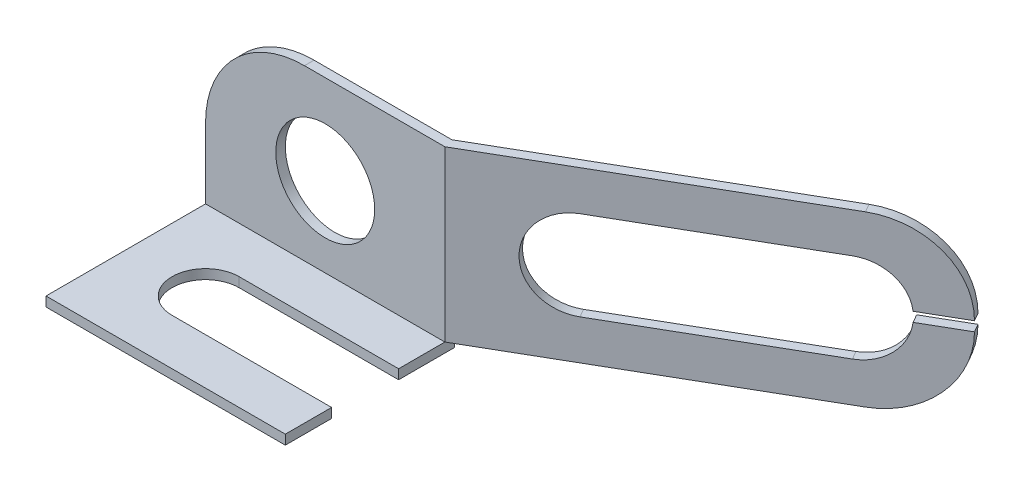
ISO-10303-21;
HEADER;
FILE_DESCRIPTION(('STEP AP214'),'2;1');
FILE_NAME('part.step','',(''),(''),'','','');
FILE_SCHEMA(('AUTOMOTIVE_DESIGN { 1 0 10303 214 1 1 1 1 }'));
ENDSEC;
DATA;
#1=APPLICATION_CONTEXT('core data for automotive mechanical design processes');
#2=APPLICATION_PROTOCOL_DEFINITION('international standard','automotive_design',2000,#1);
#3=PRODUCT_CONTEXT('',#1,'mechanical');
#4=PRODUCT('Part','Part','',(#3));
#5=PRODUCT_RELATED_PRODUCT_CATEGORY('part','',(#4));
#6=PRODUCT_DEFINITION_FORMATION('','',#4);
#7=PRODUCT_DEFINITION_CONTEXT('part definition',#1,'design');
#8=PRODUCT_DEFINITION('design','',#6,#7);
#9=PRODUCT_DEFINITION_SHAPE('','',#8);
#10=(LENGTH_UNIT() NAMED_UNIT(*) SI_UNIT(.MILLI.,.METRE.));
#11=(NAMED_UNIT(*) PLANE_ANGLE_UNIT() SI_UNIT($,.RADIAN.));
#12=(NAMED_UNIT(*) SI_UNIT($,.STERADIAN.) SOLID_ANGLE_UNIT());
#13=UNCERTAINTY_MEASURE_WITH_UNIT(LENGTH_MEASURE(1.E-05),#10,'distance_accuracy_value','');
#14=(GEOMETRIC_REPRESENTATION_CONTEXT(3) GLOBAL_UNCERTAINTY_ASSIGNED_CONTEXT((#13)) GLOBAL_UNIT_ASSIGNED_CONTEXT((#10,
#11,#12)) REPRESENTATION_CONTEXT('',''));
#15=CARTESIAN_POINT('',(0.,0.,0.));
#16=DIRECTION('',(0.,0.,1.));
#17=DIRECTION('',(1.,0.,0.));
#18=AXIS2_PLACEMENT_3D('',#15,#16,#17);
#19=CARTESIAN_POINT('',(750.,-530.,1000.));
#20=DIRECTION('',(1.,0.,0.));
#21=DIRECTION('',(0.,1.,0.));
#22=AXIS2_PLACEMENT_3D('',#19,#20,#21);
#23=PLANE('',#22);
#24=DIRECTION('',(0.,0.,-1.));
#25=VECTOR('',#24,1.);
#26=CARTESIAN_POINT('',(750.,-530.,1000.));
#27=LINE('',#26,#25);
#28=CARTESIAN_POINT('',(750.000000000014,-530.00000000002,-8.3221374941428E-12));
#29=VERTEX_POINT('',#28);
#30=CARTESIAN_POINT('',(750.,-530.,-60.));
#31=VERTEX_POINT('',#30);
#32=EDGE_CURVE('E279',#29,#31,#27,.T.);
#33=ORIENTED_EDGE('',*,*,#32,.F.);
#34=DIRECTION('',(0.,0.,-1.));
#35=VECTOR('',#34,1.);
#36=CARTESIAN_POINT('',(750.,-530.,1000.));
#37=LINE('',#36,#35);
#38=CARTESIAN_POINT('',(750.,-530.,290.));
#39=VERTEX_POINT('',#38);
#40=EDGE_CURVE('E359',#39,#29,#37,.T.);
#41=ORIENTED_EDGE('',*,*,#40,.F.);
#42=DIRECTION('',(0.,1.,0.));
#43=VECTOR('',#42,1.);
#44=CARTESIAN_POINT('',(750.,-590.,290.));
#45=LINE('',#44,#43);
#46=CARTESIAN_POINT('',(750.,-590.,290.));
#47=VERTEX_POINT('',#46);
#48=EDGE_CURVE('E303',#47,#39,#45,.T.);
#49=ORIENTED_EDGE('',*,*,#48,.F.);
#50=DIRECTION('',(0.,0.,-1.));
#51=VECTOR('',#50,1.);
#52=CARTESIAN_POINT('',(750.000000000001,-590.,1000.));
#53=LINE('',#52,#51);
#54=CARTESIAN_POINT('',(750.,-590.,-60.));
#55=VERTEX_POINT('',#54);
#56=EDGE_CURVE('E45',#47,#55,#53,.T.);
#57=ORIENTED_EDGE('',*,*,#56,.T.);
#58=DIRECTION('',(0.,1.,0.));
#59=VECTOR('',#58,1.);
#60=CARTESIAN_POINT('',(750.,-590.,-60.));
#61=LINE('',#60,#59);
#62=EDGE_CURVE('E341',#55,#31,#61,.T.);
#63=ORIENTED_EDGE('',*,*,#62,.T.);
#64=EDGE_LOOP('',(#33,#41,#49,#57,#63));
#65=FACE_BOUND('',#64,.T.);
#66=ADVANCED_FACE('F37',(#65),#23,.T.);
#67=CARTESIAN_POINT('',(-750.000000000001,-590.,1000.));
#68=DIRECTION('',(0.,1.,0.));
#69=DIRECTION('',(0.,0.,1.));
#70=AXIS2_PLACEMENT_3D('',#67,#68,#69);
#71=PLANE('',#70);
#72=ORIENTED_EDGE('',*,*,#56,.F.);
#73=DIRECTION('',(-1.,0.,0.));
#74=VECTOR('',#73,1.);
#75=CARTESIAN_POINT('',(-250.,-590.,290.));
#76=LINE('',#75,#74);
#77=CARTESIAN_POINT('',(-250.,-590.,290.));
#78=VERTEX_POINT('',#77);
#79=EDGE_CURVE('E291',#47,#78,#76,.T.);
#80=ORIENTED_EDGE('',*,*,#79,.T.);
#81=CARTESIAN_POINT('',(-250.,-590.,500.));
#82=DIRECTION('',(0.,1.,0.));
#83=DIRECTION('',(0.,0.,1.));
#84=AXIS2_PLACEMENT_3D('',#81,#82,#83);
#85=CIRCLE('',#84,210.);
#86=CARTESIAN_POINT('',(-250.,-590.,710.));
#87=VERTEX_POINT('',#86);
#88=EDGE_CURVE('E284',#78,#87,#85,.T.);
#89=ORIENTED_EDGE('',*,*,#88,.T.);
#90=DIRECTION('',(1.,0.,0.));
#91=VECTOR('',#90,1.);
#92=CARTESIAN_POINT('',(-250.,-590.,710.));
#93=LINE('',#92,#91);
#94=CARTESIAN_POINT('',(750.,-590.,710.));
#95=VERTEX_POINT('',#94);
#96=EDGE_CURVE('E287',#87,#95,#93,.T.);
#97=ORIENTED_EDGE('',*,*,#96,.T.);
#98=CARTESIAN_POINT('',(750.000000000001,-590.,1000.));
#99=VERTEX_POINT('',#98);
#100=EDGE_CURVE('E11',#99,#95,#53,.T.);
#101=ORIENTED_EDGE('',*,*,#100,.F.);
#102=DIRECTION('',(1.,0.,0.));
#103=VECTOR('',#102,1.);
#104=CARTESIAN_POINT('',(-750.000000000001,-590.,1000.));
#105=LINE('',#104,#103);
#106=CARTESIAN_POINT('',(-750.000000000001,-590.,1000.));
#107=VERTEX_POINT('',#106);
#108=EDGE_CURVE('E345',#107,#99,#105,.T.);
#109=ORIENTED_EDGE('',*,*,#108,.F.);
#110=DIRECTION('',(0.,0.,-1.));
#111=VECTOR('',#110,1.);
#112=CARTESIAN_POINT('',(-750.000000000001,-590.,1000.));
#113=LINE('',#112,#111);
#114=CARTESIAN_POINT('',(-750.,-590.,-60.));
#115=VERTEX_POINT('',#114);
#116=EDGE_CURVE('E355',#107,#115,#113,.T.);
#117=ORIENTED_EDGE('',*,*,#116,.T.);
#118=DIRECTION('',(1.,0.,0.));
#119=VECTOR('',#118,1.);
#120=CARTESIAN_POINT('',(-750.,-590.,-60.));
#121=LINE('',#120,#119);
#122=EDGE_CURVE('E337',#115,#55,#121,.T.);
#123=ORIENTED_EDGE('',*,*,#122,.T.);
#124=EDGE_LOOP('',(#72,#80,#89,#97,#101,#109,#117,#123));
#125=FACE_BOUND('',#124,.T.);
#126=ADVANCED_FACE('F39',(#125),#71,.F.);
#127=DIRECTION('',(0.,1.,0.));
#128=VECTOR('',#127,1.);
#129=CARTESIAN_POINT('',(750.,-590.,710.));
#130=LINE('',#129,#128);
#131=CARTESIAN_POINT('',(750.,-530.,710.));
#132=VERTEX_POINT('',#131);
#133=EDGE_CURVE('E305',#95,#132,#130,.T.);
#134=ORIENTED_EDGE('',*,*,#133,.T.);
#135=CARTESIAN_POINT('',(750.,-530.,1000.));
#136=VERTEX_POINT('',#135);
#137=EDGE_CURVE('E360',#136,#132,#37,.T.);
#138=ORIENTED_EDGE('',*,*,#137,.F.);
#139=DIRECTION('',(0.,-1.,0.));
#140=VECTOR('',#139,1.);
#141=CARTESIAN_POINT('',(750.,-530.,1000.));
#142=LINE('',#141,#140);
#143=EDGE_CURVE('E347',#136,#99,#142,.T.);
#144=ORIENTED_EDGE('',*,*,#143,.T.);
#145=ORIENTED_EDGE('',*,*,#100,.T.);
#146=EDGE_LOOP('',(#134,#138,#144,#145));
#147=FACE_BOUND('',#146,.T.);
#148=ADVANCED_FACE('F407',(#147),#23,.T.);
#149=CARTESIAN_POINT('',(-750.,-530.,1000.));
#150=DIRECTION('',(0.,1.,0.));
#151=DIRECTION('',(0.,0.,1.));
#152=AXIS2_PLACEMENT_3D('',#149,#150,#151);
#153=PLANE('',#152);
#154=DIRECTION('',(-1.,0.,0.));
#155=VECTOR('',#154,1.);
#156=CARTESIAN_POINT('',(-250.,-530.,290.));
#157=LINE('',#156,#155);
#158=CARTESIAN_POINT('',(-250.,-530.,290.));
#159=VERTEX_POINT('',#158);
#160=EDGE_CURVE('E288',#39,#159,#157,.T.);
#161=ORIENTED_EDGE('',*,*,#160,.F.);
#162=ORIENTED_EDGE('',*,*,#40,.T.);
#163=DIRECTION('',(1.,0.,0.));
#164=VECTOR('',#163,1.);
#165=CARTESIAN_POINT('',(0.,-530.,0.));
#166=LINE('',#165,#164);
#167=CARTESIAN_POINT('',(-750.,-530.,0.));
#168=VERTEX_POINT('',#167);
#169=EDGE_CURVE('E331',#168,#29,#166,.T.);
#170=ORIENTED_EDGE('',*,*,#169,.F.);
#171=DIRECTION('',(0.,0.,-1.));
#172=VECTOR('',#171,1.);
#173=CARTESIAN_POINT('',(-750.,-530.,1000.));
#174=LINE('',#173,#172);
#175=CARTESIAN_POINT('',(-750.,-530.,1000.));
#176=VERTEX_POINT('',#175);
#177=EDGE_CURVE('E357',#176,#168,#174,.T.);
#178=ORIENTED_EDGE('',*,*,#177,.F.);
#179=DIRECTION('',(1.,0.,0.));
#180=VECTOR('',#179,1.);
#181=CARTESIAN_POINT('',(-750.,-530.,1000.));
#182=LINE('',#181,#180);
#183=EDGE_CURVE('E350',#176,#136,#182,.T.);
#184=ORIENTED_EDGE('',*,*,#183,.T.);
#185=ORIENTED_EDGE('',*,*,#137,.T.);
#186=DIRECTION('',(1.,0.,0.));
#187=VECTOR('',#186,1.);
#188=CARTESIAN_POINT('',(-250.,-530.,710.));
#189=LINE('',#188,#187);
#190=CARTESIAN_POINT('',(-250.,-530.,710.));
#191=VERTEX_POINT('',#190);
#192=EDGE_CURVE('E296',#191,#132,#189,.T.);
#193=ORIENTED_EDGE('',*,*,#192,.F.);
#194=CARTESIAN_POINT('',(-250.,-530.,500.));
#195=DIRECTION('',(0.,1.,0.));
#196=DIRECTION('',(0.,0.,1.));
#197=AXIS2_PLACEMENT_3D('',#194,#195,#196);
#198=CIRCLE('',#197,210.);
#199=EDGE_CURVE('E283',#159,#191,#198,.T.);
#200=ORIENTED_EDGE('',*,*,#199,.F.);
#201=EDGE_LOOP('',(#161,#162,#170,#178,#184,#185,#193,#200));
#202=FACE_BOUND('',#201,.T.);
#203=ADVANCED_FACE('F368',(#202),#153,.T.);
#204=CARTESIAN_POINT('',(-750.,-530.,1000.));
#205=DIRECTION('',(1.,0.,0.));
#206=DIRECTION('',(0.,1.,0.));
#207=AXIS2_PLACEMENT_3D('',#204,#205,#206);
#208=PLANE('',#207);
#209=ORIENTED_EDGE('',*,*,#177,.T.);
#210=DIRECTION('',(0.,-1.,0.));
#211=VECTOR('',#210,1.);
#212=CARTESIAN_POINT('',(-750.000000000001,-1.89242561015654E-13,0.));
#213=LINE('',#212,#211);
#214=CARTESIAN_POINT('',(-750.000000000001,-90.0000000000041,0.));
#215=VERTEX_POINT('',#214);
#216=EDGE_CURVE('E328',#215,#168,#213,.T.);
#217=ORIENTED_EDGE('',*,*,#216,.F.);
#218=DIRECTION('',(0.,0.,1.));
#219=VECTOR('',#218,1.);
#220=CARTESIAN_POINT('',(-750.000000000001,-90.0000000000041,-60.));
#221=LINE('',#220,#219);
#222=CARTESIAN_POINT('',(-750.000000000001,-90.0000000000041,-60.));
#223=VERTEX_POINT('',#222);
#224=EDGE_CURVE('E335',#223,#215,#221,.T.);
#225=ORIENTED_EDGE('',*,*,#224,.F.);
#226=DIRECTION('',(0.,1.,0.));
#227=VECTOR('',#226,1.);
#228=CARTESIAN_POINT('',(-750.,-590.,-60.));
#229=LINE('',#228,#227);
#230=EDGE_CURVE('E343',#115,#223,#229,.T.);
#231=ORIENTED_EDGE('',*,*,#230,.F.);
#232=ORIENTED_EDGE('',*,*,#116,.F.);
#233=DIRECTION('',(0.,-1.,0.));
#234=VECTOR('',#233,1.);
#235=CARTESIAN_POINT('',(-750.,-530.,1000.));
#236=LINE('',#235,#234);
#237=EDGE_CURVE('E353',#176,#107,#236,.T.);
#238=ORIENTED_EDGE('',*,*,#237,.F.);
#239=EDGE_LOOP('',(#209,#217,#225,#231,#232,#238));
#240=FACE_BOUND('',#239,.T.);
#241=ADVANCED_FACE('F396',(#240),#208,.F.);
#242=CARTESIAN_POINT('',(0.,0.,1000.));
#243=DIRECTION('',(0.,0.,-1.));
#244=DIRECTION('',(-1.,0.,0.));
#245=AXIS2_PLACEMENT_3D('',#242,#243,#244);
#246=PLANE('',#245);
#247=ORIENTED_EDGE('',*,*,#108,.T.);
#248=ORIENTED_EDGE('',*,*,#143,.F.);
#249=ORIENTED_EDGE('',*,*,#183,.F.);
#250=ORIENTED_EDGE('',*,*,#237,.T.);
#251=EDGE_LOOP('',(#247,#248,#249,#250));
#252=FACE_BOUND('',#251,.T.);
#253=ADVANCED_FACE('F403',(#252),#246,.F.);
#254=CARTESIAN_POINT('',(-750.,-590.,-60.));
#255=DIRECTION('',(0.,0.,1.));
#256=DIRECTION('',(1.,0.,0.));
#257=AXIS2_PLACEMENT_3D('',#254,#255,#256);
#258=PLANE('',#257);
#259=DIRECTION('',(0.,-1.,0.));
#260=VECTOR('',#259,1.);
#261=CARTESIAN_POINT('',(733.923048454133,-589.999999999972,-60.));
#262=LINE('',#261,#260);
#263=CARTESIAN_POINT('',(733.923048454113,530.,-60.));
#264=VERTEX_POINT('',#263);
#265=CARTESIAN_POINT('',(733.923048454132,-530.00000000002,-60.));
#266=VERTEX_POINT('',#265);
#267=EDGE_CURVE('E52',#264,#266,#262,.T.);
#268=ORIENTED_EDGE('',*,*,#267,.T.);
#269=DIRECTION('',(1.,0.,0.));
#270=VECTOR('',#269,1.);
#271=CARTESIAN_POINT('',(-750.000000000002,-530.000000000027,-60.));
#272=LINE('',#271,#270);
#273=EDGE_CURVE('E56',#266,#31,#272,.T.);
#274=ORIENTED_EDGE('',*,*,#273,.T.);
#275=ORIENTED_EDGE('',*,*,#62,.F.);
#276=ORIENTED_EDGE('',*,*,#122,.F.);
#277=ORIENTED_EDGE('',*,*,#230,.T.);
#278=CARTESIAN_POINT('',(-130.000000000001,-89.9999999999995,-60.));
#279=DIRECTION('',(0.,0.,1.));
#280=DIRECTION('',(1.,0.,0.));
#281=AXIS2_PLACEMENT_3D('',#278,#279,#280);
#282=CIRCLE('',#281,620.);
#283=CARTESIAN_POINT('',(-129.999999999996,530.,-60.));
#284=VERTEX_POINT('',#283);
#285=EDGE_CURVE('E316',#284,#223,#282,.T.);
#286=ORIENTED_EDGE('',*,*,#285,.F.);
#287=DIRECTION('',(1.,0.,0.));
#288=VECTOR('',#287,1.);
#289=CARTESIAN_POINT('',(0.,530.,-60.));
#290=LINE('',#289,#288);
#291=EDGE_CURVE('E313',#284,#264,#290,.T.);
#292=ORIENTED_EDGE('',*,*,#291,.T.);
#293=EDGE_LOOP('',(#268,#274,#275,#276,#277,#286,#292));
#294=FACE_BOUND('',#293,.T.);
#295=CARTESIAN_POINT('',(0.,-29.9999999999997,-60.));
#296=DIRECTION('',(0.,0.,1.));
#297=DIRECTION('',(1.,0.,0.));
#298=AXIS2_PLACEMENT_3D('',#295,#296,#297);
#299=CIRCLE('',#298,310.);
#300=CARTESIAN_POINT('',(310.,-29.9999999999997,-60.));
#301=VERTEX_POINT('',#300);
#302=EDGE_CURVE('E310',#301,#301,#299,.T.);
#303=ORIENTED_EDGE('',*,*,#302,.T.);
#304=EDGE_LOOP('',(#303));
#305=FACE_BOUND('',#304,.T.);
#306=ADVANCED_FACE('F419',(#294,#305),#258,.F.);
#307=CARTESIAN_POINT('',(0.,530.,-60.));
#308=DIRECTION('',(0.,-1.,0.));
#309=DIRECTION('',(0.,0.,-1.));
#310=AXIS2_PLACEMENT_3D('',#307,#308,#309);
#311=PLANE('',#310);
#312=DIRECTION('',(1.,0.,0.));
#313=VECTOR('',#312,1.);
#314=CARTESIAN_POINT('',(0.,530.,0.));
#315=LINE('',#314,#313);
#316=CARTESIAN_POINT('',(-129.999999999996,530.,0.));
#317=VERTEX_POINT('',#316);
#318=CARTESIAN_POINT('',(749.999999999999,530.,0.));
#319=VERTEX_POINT('',#318);
#320=EDGE_CURVE('E322',#317,#319,#315,.T.);
#321=ORIENTED_EDGE('',*,*,#320,.T.);
#322=DIRECTION('',(0.866025403784435,0.,-0.500000000000007));
#323=VECTOR('',#322,1.);
#324=CARTESIAN_POINT('',(187.499999999993,529.99999999999,324.759526419163));
#325=LINE('',#324,#323);
#326=CARTESIAN_POINT('',(2421.42902930395,530.000000000031,-965.00000000002));
#327=VERTEX_POINT('',#326);
#328=EDGE_CURVE('E242',#319,#327,#325,.T.);
#329=ORIENTED_EDGE('',*,*,#328,.T.);
#330=DIRECTION('',(0.500000000000007,0.,0.866025403784434));
#331=VECTOR('',#330,1.);
#332=CARTESIAN_POINT('',(2391.42902930395,530.000000000031,-1016.96152422709));
#333=LINE('',#332,#331);
#334=CARTESIAN_POINT('',(2391.42902930395,530.000000000031,-1016.96152422709));
#335=VERTEX_POINT('',#334);
#336=EDGE_CURVE('E272',#335,#327,#333,.T.);
#337=ORIENTED_EDGE('',*,*,#336,.F.);
#338=DIRECTION('',(0.866025403784435,0.,-0.500000000000007));
#339=VECTOR('',#338,1.);
#340=CARTESIAN_POINT('',(157.499999999993,529.999999999989,272.798002192097));
#341=LINE('',#340,#339);
#342=EDGE_CURVE('E216',#264,#335,#341,.T.);
#343=ORIENTED_EDGE('',*,*,#342,.F.);
#344=ORIENTED_EDGE('',*,*,#291,.F.);
#345=DIRECTION('',(0.,0.,1.));
#346=VECTOR('',#345,1.);
#347=CARTESIAN_POINT('',(-129.999999999996,530.,-60.));
#348=LINE('',#347,#346);
#349=EDGE_CURVE('E319',#284,#317,#348,.T.);
#350=ORIENTED_EDGE('',*,*,#349,.T.);
#351=EDGE_LOOP('',(#321,#329,#337,#343,#344,#350));
#352=FACE_BOUND('',#351,.T.);
#353=ADVANCED_FACE('F386',(#352),#311,.F.);
#354=CARTESIAN_POINT('',(0.,-29.9999999999997,-60.));
#355=DIRECTION('',(0.,0.,1.));
#356=DIRECTION('',(1.,0.,0.));
#357=AXIS2_PLACEMENT_3D('',#354,#355,#356);
#358=CYLINDRICAL_SURFACE('',#357,310.);
#359=ORIENTED_EDGE('',*,*,#302,.F.);
#360=EDGE_LOOP('',(#359));
#361=FACE_BOUND('',#360,.T.);
#362=CARTESIAN_POINT('',(0.,-29.9999999999997,0.));
#363=DIRECTION('',(0.,0.,1.));
#364=DIRECTION('',(1.,0.,0.));
#365=AXIS2_PLACEMENT_3D('',#362,#363,#364);
#366=CIRCLE('',#365,310.);
#367=CARTESIAN_POINT('',(310.,-29.9999999999997,0.));
#368=VERTEX_POINT('',#367);
#369=EDGE_CURVE('E302',#368,#368,#366,.T.);
#370=ORIENTED_EDGE('',*,*,#369,.T.);
#371=EDGE_LOOP('',(#370));
#372=FACE_BOUND('',#371,.T.);
#373=ADVANCED_FACE('F425',(#361,#372),#358,.F.);
#374=CARTESIAN_POINT('',(-130.000000000001,-89.9999999999995,-60.));
#375=DIRECTION('',(0.,0.,1.));
#376=DIRECTION('',(1.,0.,0.));
#377=AXIS2_PLACEMENT_3D('',#374,#375,#376);
#378=CYLINDRICAL_SURFACE('',#377,620.);
#379=CARTESIAN_POINT('',(-130.000000000001,-89.9999999999995,0.));
#380=DIRECTION('',(0.,0.,1.));
#381=DIRECTION('',(1.,0.,0.));
#382=AXIS2_PLACEMENT_3D('',#379,#380,#381);
#383=CIRCLE('',#382,620.);
#384=EDGE_CURVE('E325',#317,#215,#383,.T.);
#385=ORIENTED_EDGE('',*,*,#384,.F.);
#386=ORIENTED_EDGE('',*,*,#349,.F.);
#387=ORIENTED_EDGE('',*,*,#285,.T.);
#388=ORIENTED_EDGE('',*,*,#224,.T.);
#389=EDGE_LOOP('',(#385,#386,#387,#388));
#390=FACE_BOUND('',#389,.T.);
#391=ADVANCED_FACE('F392',(#390),#378,.T.);
#392=CARTESIAN_POINT('',(0.,0.,0.));
#393=DIRECTION('',(0.,0.,1.));
#394=DIRECTION('',(1.,0.,0.));
#395=AXIS2_PLACEMENT_3D('',#392,#393,#394);
#396=PLANE('',#395);
#397=ORIENTED_EDGE('',*,*,#369,.F.);
#398=EDGE_LOOP('',(#397));
#399=FACE_BOUND('',#398,.T.);
#400=ORIENTED_EDGE('',*,*,#320,.F.);
#401=ORIENTED_EDGE('',*,*,#384,.T.);
#402=ORIENTED_EDGE('',*,*,#216,.T.);
#403=ORIENTED_EDGE('',*,*,#169,.T.);
#404=DIRECTION('',(0.,-1.,0.));
#405=VECTOR('',#404,1.);
#406=CARTESIAN_POINT('',(749.999999999999,1.57107031786579E-13,0.));
#407=LINE('',#406,#405);
#408=EDGE_CURVE('E314',#319,#29,#407,.T.);
#409=ORIENTED_EDGE('',*,*,#408,.F.);
#410=EDGE_LOOP('',(#400,#401,#402,#403,#409));
#411=FACE_BOUND('',#410,.T.);
#412=ADVANCED_FACE('F383',(#399,#411),#396,.T.);
#413=CARTESIAN_POINT('',(-250.,-590.,500.));
#414=DIRECTION('',(0.,1.,0.));
#415=DIRECTION('',(0.,0.,1.));
#416=AXIS2_PLACEMENT_3D('',#413,#414,#415);
#417=CYLINDRICAL_SURFACE('',#416,210.);
#418=ORIENTED_EDGE('',*,*,#199,.T.);
#419=DIRECTION('',(0.,1.,0.));
#420=VECTOR('',#419,1.);
#421=CARTESIAN_POINT('',(-250.,-590.,710.));
#422=LINE('',#421,#420);
#423=EDGE_CURVE('E294',#87,#191,#422,.T.);
#424=ORIENTED_EDGE('',*,*,#423,.F.);
#425=ORIENTED_EDGE('',*,*,#88,.F.);
#426=DIRECTION('',(0.,1.,0.));
#427=VECTOR('',#426,1.);
#428=CARTESIAN_POINT('',(-250.,-590.,290.));
#429=LINE('',#428,#427);
#430=EDGE_CURVE('E300',#78,#159,#429,.T.);
#431=ORIENTED_EDGE('',*,*,#430,.T.);
#432=EDGE_LOOP('',(#418,#424,#425,#431));
#433=FACE_BOUND('',#432,.T.);
#434=ADVANCED_FACE('F415',(#433),#417,.F.);
#435=CARTESIAN_POINT('',(-250.,-590.,290.));
#436=DIRECTION('',(0.,0.,-1.));
#437=DIRECTION('',(-1.,0.,0.));
#438=AXIS2_PLACEMENT_3D('',#435,#436,#437);
#439=PLANE('',#438);
#440=ORIENTED_EDGE('',*,*,#160,.T.);
#441=ORIENTED_EDGE('',*,*,#430,.F.);
#442=ORIENTED_EDGE('',*,*,#79,.F.);
#443=ORIENTED_EDGE('',*,*,#48,.T.);
#444=EDGE_LOOP('',(#440,#441,#442,#443));
#445=FACE_BOUND('',#444,.T.);
#446=ADVANCED_FACE('F417',(#445),#439,.F.);
#447=CARTESIAN_POINT('',(-250.,-590.,710.));
#448=DIRECTION('',(0.,0.,1.));
#449=DIRECTION('',(1.,0.,0.));
#450=AXIS2_PLACEMENT_3D('',#447,#448,#449);
#451=PLANE('',#450);
#452=ORIENTED_EDGE('',*,*,#192,.T.);
#453=ORIENTED_EDGE('',*,*,#133,.F.);
#454=ORIENTED_EDGE('',*,*,#96,.F.);
#455=ORIENTED_EDGE('',*,*,#423,.T.);
#456=EDGE_LOOP('',(#452,#453,#454,#455));
#457=FACE_BOUND('',#456,.T.);
#458=ADVANCED_FACE('F410',(#457),#451,.F.);
#459=CARTESIAN_POINT('',(157.500000000002,2.87964097012149E-12,272.798002192097));
#460=DIRECTION('',(-0.500000000000007,0.,-0.866025403784435));
#461=DIRECTION('',(-0.866025403784435,0.,0.500000000000007));
#462=AXIS2_PLACEMENT_3D('',#459,#460,#461);
#463=PLANE('',#462);
#464=ORIENTED_EDGE('',*,*,#267,.F.);
#465=ORIENTED_EDGE('',*,*,#342,.T.);
#466=CARTESIAN_POINT('',(2391.42902930396,30.0000000000308,-1016.96152422709));
#467=DIRECTION('',(-0.500000000000007,0.,-0.866025403784435));
#468=DIRECTION('',(-0.866025403784435,0.,0.500000000000007));
#469=AXIS2_PLACEMENT_3D('',#466,#467,#468);
#470=CIRCLE('',#469,500.);
#471=CARTESIAN_POINT('',(2824.44173119618,30.0000000000517,-1266.96152422709));
#472=VERTEX_POINT('',#471);
#473=EDGE_CURVE('E218',#335,#472,#470,.T.);
#474=ORIENTED_EDGE('',*,*,#473,.T.);
#475=DIRECTION('',(-0.866025403784435,0.,0.500000000000007));
#476=VECTOR('',#475,1.);
#477=CARTESIAN_POINT('',(157.500000000002,30.0000000000259,272.798002192097));
#478=LINE('',#477,#476);
#479=CARTESIAN_POINT('',(2580.55877410172,30.0000000000343,-1126.15563329784));
#480=VERTEX_POINT('',#479);
#481=EDGE_CURVE('E220',#472,#480,#478,.T.);
#482=ORIENTED_EDGE('',*,*,#481,.T.);
#483=CARTESIAN_POINT('',(2339.4675050769,4.32888448249791E-11,-986.961524227087));
#484=DIRECTION('',(-0.500000000000007,0.,-0.866025403784435));
#485=DIRECTION('',(-0.866025403784435,0.,0.500000000000007));
#486=AXIS2_PLACEMENT_3D('',#483,#484,#485);
#487=CIRCLE('',#486,280.);
#488=CARTESIAN_POINT('',(2339.46750507689,280.000000000043,-986.961524227087));
#489=VERTEX_POINT('',#488);
#490=EDGE_CURVE('E222',#489,#480,#487,.T.);
#491=ORIENTED_EDGE('',*,*,#490,.F.);
#492=DIRECTION('',(0.866025403784435,0.,-0.500000000000007));
#493=VECTOR('',#492,1.);
#494=CARTESIAN_POINT('',(157.499999999995,279.999999999976,272.798002192099));
#495=LINE('',#494,#493);
#496=CARTESIAN_POINT('',(1256.93575034635,280.00000000001,-361.961524227078));
#497=VERTEX_POINT('',#496);
#498=EDGE_CURVE('E225',#497,#489,#495,.T.);
#499=ORIENTED_EDGE('',*,*,#498,.F.);
#500=CARTESIAN_POINT('',(1256.93575034635,9.71326260805677E-12,-361.961524227079));
#501=DIRECTION('',(-0.500000000000007,0.,-0.866025403784435));
#502=DIRECTION('',(-0.866025403784435,0.,0.500000000000007));
#503=AXIS2_PLACEMENT_3D('',#500,#501,#502);
#504=CIRCLE('',#503,280.);
#505=CARTESIAN_POINT('',(1256.93575034636,-279.99999999999,-361.961524227079));
#506=VERTEX_POINT('',#505);
#507=EDGE_CURVE('E228',#506,#497,#504,.T.);
#508=ORIENTED_EDGE('',*,*,#507,.F.);
#509=DIRECTION('',(0.866025403784435,0.,-0.500000000000007));
#510=VECTOR('',#509,1.);
#511=CARTESIAN_POINT('',(157.50000000001,-280.000000000024,272.798002192096));
#512=LINE('',#511,#510);
#513=CARTESIAN_POINT('',(2339.4675050769,-279.999999999957,-986.961524227087));
#514=VERTEX_POINT('',#513);
#515=EDGE_CURVE('E204',#506,#514,#512,.T.);
#516=ORIENTED_EDGE('',*,*,#515,.T.);
#517=CARTESIAN_POINT('',(2339.4675050769,4.32888448249791E-11,-986.961524227087));
#518=DIRECTION('',(-0.500000000000007,0.,-0.866025403784435));
#519=DIRECTION('',(-0.866025403784435,0.,0.500000000000007));
#520=AXIS2_PLACEMENT_3D('',#517,#518,#519);
#521=CIRCLE('',#520,280.);
#522=CARTESIAN_POINT('',(2580.55877410172,-29.9999999999659,-1126.15563329784));
#523=VERTEX_POINT('',#522);
#524=EDGE_CURVE('E188',#523,#514,#521,.T.);
#525=ORIENTED_EDGE('',*,*,#524,.F.);
#526=DIRECTION('',(-0.866025403784435,0.,0.500000000000007));
#527=VECTOR('',#526,1.);
#528=CARTESIAN_POINT('',(157.500000000003,-30.0000000000471,272.798002192097));
#529=LINE('',#528,#527);
#530=CARTESIAN_POINT('',(2824.44173119618,-29.9999999999775,-1266.96152422709));
#531=VERTEX_POINT('',#530);
#532=EDGE_CURVE('E201',#531,#523,#529,.T.);
#533=ORIENTED_EDGE('',*,*,#532,.F.);
#534=CARTESIAN_POINT('',(2391.42902930396,-29.9999999999694,-1016.96152422709));
#535=DIRECTION('',(-0.500000000000007,0.,-0.866025403784435));
#536=DIRECTION('',(-0.866025403784435,0.,0.500000000000007));
#537=AXIS2_PLACEMENT_3D('',#534,#535,#536);
#538=CIRCLE('',#537,500.);
#539=CARTESIAN_POINT('',(2391.42902930397,-529.999999999969,-1016.96152422709));
#540=VERTEX_POINT('',#539);
#541=EDGE_CURVE('E210',#531,#540,#538,.T.);
#542=ORIENTED_EDGE('',*,*,#541,.T.);
#543=DIRECTION('',(0.866025403784435,0.,-0.500000000000007));
#544=VECTOR('',#543,1.);
#545=CARTESIAN_POINT('',(157.500000000012,-530.000000000011,272.798002192097));
#546=LINE('',#545,#544);
#547=EDGE_CURVE('E212',#266,#540,#546,.T.);
#548=ORIENTED_EDGE('',*,*,#547,.F.);
#549=EDGE_LOOP('',(#464,#465,#474,#482,#491,#499,#508,#516,#525,#533,#542,#548));
#550=FACE_BOUND('',#549,.T.);
#551=ADVANCED_FACE('F199',(#550),#463,.T.);
#552=CARTESIAN_POINT('',(2339.4675050769,4.32888448249791E-11,-986.961524227087));
#553=DIRECTION('',(0.500000000000007,0.,0.866025403784434));
#554=DIRECTION('',(0.866025403784435,0.,-0.500000000000007));
#555=AXIS2_PLACEMENT_3D('',#552,#553,#554);
#556=CYLINDRICAL_SURFACE('',#555,280.);
#557=CARTESIAN_POINT('',(2369.4675050769,4.38439563372917E-11,-935.000000000021));
#558=DIRECTION('',(-0.500000000000007,0.,-0.866025403784435));
#559=DIRECTION('',(-0.866025403784435,0.,0.500000000000007));
#560=AXIS2_PLACEMENT_3D('',#557,#558,#559);
#561=CIRCLE('',#560,280.);
#562=CARTESIAN_POINT('',(2610.55877410172,-29.9999999999654,-1074.19410907077));
#563=VERTEX_POINT('',#562);
#564=CARTESIAN_POINT('',(2369.4675050769,-279.999999999956,-935.000000000021));
#565=VERTEX_POINT('',#564);
#566=EDGE_CURVE('E190',#563,#565,#561,.T.);
#567=ORIENTED_EDGE('',*,*,#566,.F.);
#568=DIRECTION('',(0.500000000000007,0.,0.866025403784434));
#569=VECTOR('',#568,1.);
#570=CARTESIAN_POINT('',(2580.55877410172,-29.9999999999659,-1126.15563329784));
#571=LINE('',#570,#569);
#572=EDGE_CURVE('E185',#523,#563,#571,.T.);
#573=ORIENTED_EDGE('',*,*,#572,.F.);
#574=ORIENTED_EDGE('',*,*,#524,.T.);
#575=DIRECTION('',(0.500000000000007,0.,0.866025403784434));
#576=VECTOR('',#575,1.);
#577=CARTESIAN_POINT('',(2339.4675050769,-279.999999999957,-986.961524227087));
#578=LINE('',#577,#576);
#579=EDGE_CURVE('E232',#514,#565,#578,.T.);
#580=ORIENTED_EDGE('',*,*,#579,.T.);
#581=EDGE_LOOP('',(#567,#573,#574,#580));
#582=FACE_BOUND('',#581,.T.);
#583=ADVANCED_FACE('F187',(#582),#556,.F.);
#584=CARTESIAN_POINT('',(157.500000000003,-30.0000000000471,272.798002192097));
#585=DIRECTION('',(0.,1.,0.));
#586=DIRECTION('',(-1.,0.,0.));
#587=AXIS2_PLACEMENT_3D('',#584,#585,#586);
#588=PLANE('',#587);
#589=DIRECTION('',(-0.866025403784435,0.,0.500000000000007));
#590=VECTOR('',#589,1.);
#591=CARTESIAN_POINT('',(187.500000000004,-30.0000000000466,324.759526419163));
#592=LINE('',#591,#590);
#593=CARTESIAN_POINT('',(2854.44173119618,-29.999999999977,-1215.00000000003));
#594=VERTEX_POINT('',#593);
#595=EDGE_CURVE('E234',#594,#563,#592,.T.);
#596=ORIENTED_EDGE('',*,*,#595,.F.);
#597=DIRECTION('',(0.500000000000007,0.,0.866025403784434));
#598=VECTOR('',#597,1.);
#599=CARTESIAN_POINT('',(2824.44173119618,-29.9999999999775,-1266.96152422709));
#600=LINE('',#599,#598);
#601=EDGE_CURVE('E195',#531,#594,#600,.T.);
#602=ORIENTED_EDGE('',*,*,#601,.F.);
#603=ORIENTED_EDGE('',*,*,#532,.T.);
#604=ORIENTED_EDGE('',*,*,#572,.T.);
#605=EDGE_LOOP('',(#596,#602,#603,#604));
#606=FACE_BOUND('',#605,.T.);
#607=ADVANCED_FACE('F208',(#606),#588,.T.);
#608=CARTESIAN_POINT('',(2391.42902930396,-29.9999999999694,-1016.96152422709));
#609=DIRECTION('',(0.500000000000007,0.,0.866025403784434));
#610=DIRECTION('',(0.866025403784435,0.,-0.500000000000007));
#611=AXIS2_PLACEMENT_3D('',#608,#609,#610);
#612=CYLINDRICAL_SURFACE('',#611,500.);
#613=CARTESIAN_POINT('',(2421.42902930396,-29.9999999999689,-965.000000000022));
#614=DIRECTION('',(-0.500000000000007,0.,-0.866025403784435));
#615=DIRECTION('',(-0.866025403784435,0.,0.500000000000007));
#616=AXIS2_PLACEMENT_3D('',#613,#614,#615);
#617=CIRCLE('',#616,500.);
#618=CARTESIAN_POINT('',(2421.42902930397,-529.999999999969,-965.00000000002));
#619=VERTEX_POINT('',#618);
#620=EDGE_CURVE('E236',#594,#619,#617,.T.);
#621=ORIENTED_EDGE('',*,*,#620,.T.);
#622=DIRECTION('',(0.500000000000007,0.,0.866025403784434));
#623=VECTOR('',#622,1.);
#624=CARTESIAN_POINT('',(2391.42902930397,-529.999999999969,-1016.96152422709));
#625=LINE('',#624,#623);
#626=EDGE_CURVE('E275',#540,#619,#625,.T.);
#627=ORIENTED_EDGE('',*,*,#626,.F.);
#628=ORIENTED_EDGE('',*,*,#541,.F.);
#629=ORIENTED_EDGE('',*,*,#601,.T.);
#630=EDGE_LOOP('',(#621,#627,#628,#629));
#631=FACE_BOUND('',#630,.T.);
#632=ADVANCED_FACE('F574',(#631),#612,.T.);
#633=CARTESIAN_POINT('',(157.500000000012,-530.000000000011,272.798002192097));
#634=DIRECTION('',(0.,-1.,0.));
#635=DIRECTION('',(1.,0.,0.));
#636=AXIS2_PLACEMENT_3D('',#633,#634,#635);
#637=PLANE('',#636);
#638=DIRECTION('',(0.866025403784435,0.,-0.500000000000007));
#639=VECTOR('',#638,1.);
#640=CARTESIAN_POINT('',(187.500000000013,-530.00000000001,324.759526419163));
#641=LINE('',#640,#639);
#642=EDGE_CURVE('E239',#29,#619,#641,.T.);
#643=ORIENTED_EDGE('',*,*,#642,.F.);
#644=ORIENTED_EDGE('',*,*,#32,.T.);
#645=ORIENTED_EDGE('',*,*,#273,.F.);
#646=ORIENTED_EDGE('',*,*,#547,.T.);
#647=ORIENTED_EDGE('',*,*,#626,.T.);
#648=EDGE_LOOP('',(#643,#644,#645,#646,#647));
#649=FACE_BOUND('',#648,.T.);
#650=ADVANCED_FACE('F374',(#649),#637,.T.);
#651=CARTESIAN_POINT('',(2391.42902930396,30.0000000000308,-1016.96152422709));
#652=DIRECTION('',(0.500000000000007,0.,0.866025403784434));
#653=DIRECTION('',(0.866025403784435,0.,-0.500000000000007));
#654=AXIS2_PLACEMENT_3D('',#651,#652,#653);
#655=CYLINDRICAL_SURFACE('',#654,500.);
#656=CARTESIAN_POINT('',(2421.42902930396,30.0000000000314,-965.000000000022));
#657=DIRECTION('',(-0.500000000000007,0.,-0.866025403784435));
#658=DIRECTION('',(-0.866025403784435,0.,0.500000000000007));
#659=AXIS2_PLACEMENT_3D('',#656,#657,#658);
#660=CIRCLE('',#659,500.);
#661=CARTESIAN_POINT('',(2854.44173119618,30.0000000000522,-1215.00000000003));
#662=VERTEX_POINT('',#661);
#663=EDGE_CURVE('E244',#327,#662,#660,.T.);
#664=ORIENTED_EDGE('',*,*,#663,.T.);
#665=DIRECTION('',(0.500000000000007,0.,0.866025403784434));
#666=VECTOR('',#665,1.);
#667=CARTESIAN_POINT('',(2824.44173119618,30.0000000000517,-1266.96152422709));
#668=LINE('',#667,#666);
#669=EDGE_CURVE('E269',#472,#662,#668,.T.);
#670=ORIENTED_EDGE('',*,*,#669,.F.);
#671=ORIENTED_EDGE('',*,*,#473,.F.);
#672=ORIENTED_EDGE('',*,*,#336,.T.);
#673=EDGE_LOOP('',(#664,#670,#671,#672));
#674=FACE_BOUND('',#673,.T.);
#675=ADVANCED_FACE('F590',(#674),#655,.T.);
#676=CARTESIAN_POINT('',(157.500000000002,30.0000000000259,272.798002192097));
#677=DIRECTION('',(0.,1.,0.));
#678=DIRECTION('',(-1.,0.,0.));
#679=AXIS2_PLACEMENT_3D('',#676,#677,#678);
#680=PLANE('',#679);
#681=DIRECTION('',(-0.866025403784435,0.,0.500000000000007));
#682=VECTOR('',#681,1.);
#683=CARTESIAN_POINT('',(187.500000000003,30.0000000000265,324.759526419163));
#684=LINE('',#683,#682);
#685=CARTESIAN_POINT('',(2610.55877410172,30.0000000000349,-1074.19410907077));
#686=VERTEX_POINT('',#685);
#687=EDGE_CURVE('E246',#662,#686,#684,.T.);
#688=ORIENTED_EDGE('',*,*,#687,.T.);
#689=DIRECTION('',(0.500000000000007,0.,0.866025403784434));
#690=VECTOR('',#689,1.);
#691=CARTESIAN_POINT('',(2580.55877410172,30.0000000000343,-1126.15563329784));
#692=LINE('',#691,#690);
#693=EDGE_CURVE('E267',#480,#686,#692,.T.);
#694=ORIENTED_EDGE('',*,*,#693,.F.);
#695=ORIENTED_EDGE('',*,*,#481,.F.);
#696=ORIENTED_EDGE('',*,*,#669,.T.);
#697=EDGE_LOOP('',(#688,#694,#695,#696));
#698=FACE_BOUND('',#697,.T.);
#699=ADVANCED_FACE('F598',(#698),#680,.F.);
#700=CARTESIAN_POINT('',(2339.4675050769,4.32888448249791E-11,-986.961524227087));
#701=DIRECTION('',(0.500000000000007,0.,0.866025403784434));
#702=DIRECTION('',(0.866025403784435,0.,-0.500000000000007));
#703=AXIS2_PLACEMENT_3D('',#700,#701,#702);
#704=CYLINDRICAL_SURFACE('',#703,280.);
#705=CARTESIAN_POINT('',(2369.4675050769,4.38439563372917E-11,-935.000000000021));
#706=DIRECTION('',(-0.500000000000007,0.,-0.866025403784435));
#707=DIRECTION('',(-0.866025403784435,0.,0.500000000000007));
#708=AXIS2_PLACEMENT_3D('',#705,#706,#707);
#709=CIRCLE('',#708,280.);
#710=CARTESIAN_POINT('',(2369.46750507689,280.000000000044,-935.000000000021));
#711=VERTEX_POINT('',#710);
#712=EDGE_CURVE('E249',#711,#686,#709,.T.);
#713=ORIENTED_EDGE('',*,*,#712,.F.);
#714=DIRECTION('',(0.500000000000007,0.,0.866025403784434));
#715=VECTOR('',#714,1.);
#716=CARTESIAN_POINT('',(2339.46750507689,280.000000000043,-986.961524227087));
#717=LINE('',#716,#715);
#718=EDGE_CURVE('E265',#489,#711,#717,.T.);
#719=ORIENTED_EDGE('',*,*,#718,.F.);
#720=ORIENTED_EDGE('',*,*,#490,.T.);
#721=ORIENTED_EDGE('',*,*,#693,.T.);
#722=EDGE_LOOP('',(#713,#719,#720,#721));
#723=FACE_BOUND('',#722,.T.);
#724=ADVANCED_FACE('F607',(#723),#704,.F.);
#725=CARTESIAN_POINT('',(157.499999999995,279.999999999976,272.798002192099));
#726=DIRECTION('',(0.,-1.,0.));
#727=DIRECTION('',(1.,0.,0.));
#728=AXIS2_PLACEMENT_3D('',#725,#726,#727);
#729=PLANE('',#728);
#730=DIRECTION('',(0.866025403784435,0.,-0.500000000000007));
#731=VECTOR('',#730,1.);
#732=CARTESIAN_POINT('',(187.499999999995,279.999999999976,324.759526419165));
#733=LINE('',#732,#731);
#734=CARTESIAN_POINT('',(1286.93575034635,280.00000000001,-310.000000000012));
#735=VERTEX_POINT('',#734);
#736=EDGE_CURVE('E252',#735,#711,#733,.T.);
#737=ORIENTED_EDGE('',*,*,#736,.F.);
#738=DIRECTION('',(0.500000000000007,0.,0.866025403784434));
#739=VECTOR('',#738,1.);
#740=CARTESIAN_POINT('',(1256.93575034635,280.00000000001,-361.961524227078));
#741=LINE('',#740,#739);
#742=EDGE_CURVE('E263',#497,#735,#741,.T.);
#743=ORIENTED_EDGE('',*,*,#742,.F.);
#744=ORIENTED_EDGE('',*,*,#498,.T.);
#745=ORIENTED_EDGE('',*,*,#718,.T.);
#746=EDGE_LOOP('',(#737,#743,#744,#745));
#747=FACE_BOUND('',#746,.T.);
#748=ADVANCED_FACE('F616',(#747),#729,.T.);
#749=CARTESIAN_POINT('',(1256.93575034635,9.71326260805677E-12,-361.961524227079));
#750=DIRECTION('',(0.500000000000007,0.,0.866025403784434));
#751=DIRECTION('',(0.866025403784435,0.,-0.500000000000007));
#752=AXIS2_PLACEMENT_3D('',#749,#750,#751);
#753=CYLINDRICAL_SURFACE('',#752,280.);
#754=CARTESIAN_POINT('',(1286.93575034635,1.02683741203694E-11,-310.000000000013));
#755=DIRECTION('',(-0.500000000000007,0.,-0.866025403784435));
#756=DIRECTION('',(-0.866025403784435,0.,0.500000000000007));
#757=AXIS2_PLACEMENT_3D('',#754,#755,#756);
#758=CIRCLE('',#757,280.);
#759=CARTESIAN_POINT('',(1286.93575034636,-279.99999999999,-310.000000000013));
#760=VERTEX_POINT('',#759);
#761=EDGE_CURVE('E255',#760,#735,#758,.T.);
#762=ORIENTED_EDGE('',*,*,#761,.F.);
#763=DIRECTION('',(0.500000000000007,0.,0.866025403784434));
#764=VECTOR('',#763,1.);
#765=CARTESIAN_POINT('',(1256.93575034636,-279.99999999999,-361.961524227079));
#766=LINE('',#765,#764);
#767=EDGE_CURVE('E261',#506,#760,#766,.T.);
#768=ORIENTED_EDGE('',*,*,#767,.F.);
#769=ORIENTED_EDGE('',*,*,#507,.T.);
#770=ORIENTED_EDGE('',*,*,#742,.T.);
#771=EDGE_LOOP('',(#762,#768,#769,#770));
#772=FACE_BOUND('',#771,.T.);
#773=ADVANCED_FACE('F625',(#772),#753,.F.);
#774=CARTESIAN_POINT('',(157.50000000001,-280.000000000024,272.798002192096));
#775=DIRECTION('',(0.,-1.,0.));
#776=DIRECTION('',(1.,0.,0.));
#777=AXIS2_PLACEMENT_3D('',#774,#775,#776);
#778=PLANE('',#777);
#779=DIRECTION('',(0.866025403784435,0.,-0.500000000000007));
#780=VECTOR('',#779,1.);
#781=CARTESIAN_POINT('',(187.500000000011,-280.000000000024,324.759526419162));
#782=LINE('',#781,#780);
#783=EDGE_CURVE('E206',#760,#565,#782,.T.);
#784=ORIENTED_EDGE('',*,*,#783,.T.);
#785=ORIENTED_EDGE('',*,*,#579,.F.);
#786=ORIENTED_EDGE('',*,*,#515,.F.);
#787=ORIENTED_EDGE('',*,*,#767,.T.);
#788=EDGE_LOOP('',(#784,#785,#786,#787));
#789=FACE_BOUND('',#788,.T.);
#790=ADVANCED_FACE('F634',(#789),#778,.F.);
#791=CARTESIAN_POINT('',(187.500000000003,3.43475248243408E-12,324.759526419163));
#792=DIRECTION('',(-0.500000000000007,0.,-0.866025403784435));
#793=DIRECTION('',(-0.866025403784435,0.,0.500000000000007));
#794=AXIS2_PLACEMENT_3D('',#791,#792,#793);
#795=PLANE('',#794);
#796=ORIENTED_EDGE('',*,*,#566,.T.);
#797=ORIENTED_EDGE('',*,*,#783,.F.);
#798=ORIENTED_EDGE('',*,*,#761,.T.);
#799=ORIENTED_EDGE('',*,*,#736,.T.);
#800=ORIENTED_EDGE('',*,*,#712,.T.);
#801=ORIENTED_EDGE('',*,*,#687,.F.);
#802=ORIENTED_EDGE('',*,*,#663,.F.);
#803=ORIENTED_EDGE('',*,*,#328,.F.);
#804=ORIENTED_EDGE('',*,*,#408,.T.);
#805=ORIENTED_EDGE('',*,*,#642,.T.);
#806=ORIENTED_EDGE('',*,*,#620,.F.);
#807=ORIENTED_EDGE('',*,*,#595,.T.);
#808=EDGE_LOOP('',(#796,#797,#798,#799,#800,#801,#802,#803,#804,#805,#806,#807));
#809=FACE_BOUND('',#808,.T.);
#810=ADVANCED_FACE('F379',(#809),#795,.F.);
#811=CLOSED_SHELL('',(#66,#126,#148,#203,#241,#253,#306,#353,#373,#391,#412,#434,#446,#458,#551,
#583,#607,#632,#650,#675,#699,#724,#748,#773,#790,#810));
#812=MANIFOLD_SOLID_BREP('B2',#811);
#813=ADVANCED_BREP_SHAPE_REPRESENTATION('',(#18,#812),#14);
#814=SHAPE_DEFINITION_REPRESENTATION(#9,#813);
ENDSEC;
END-ISO-10303-21;
